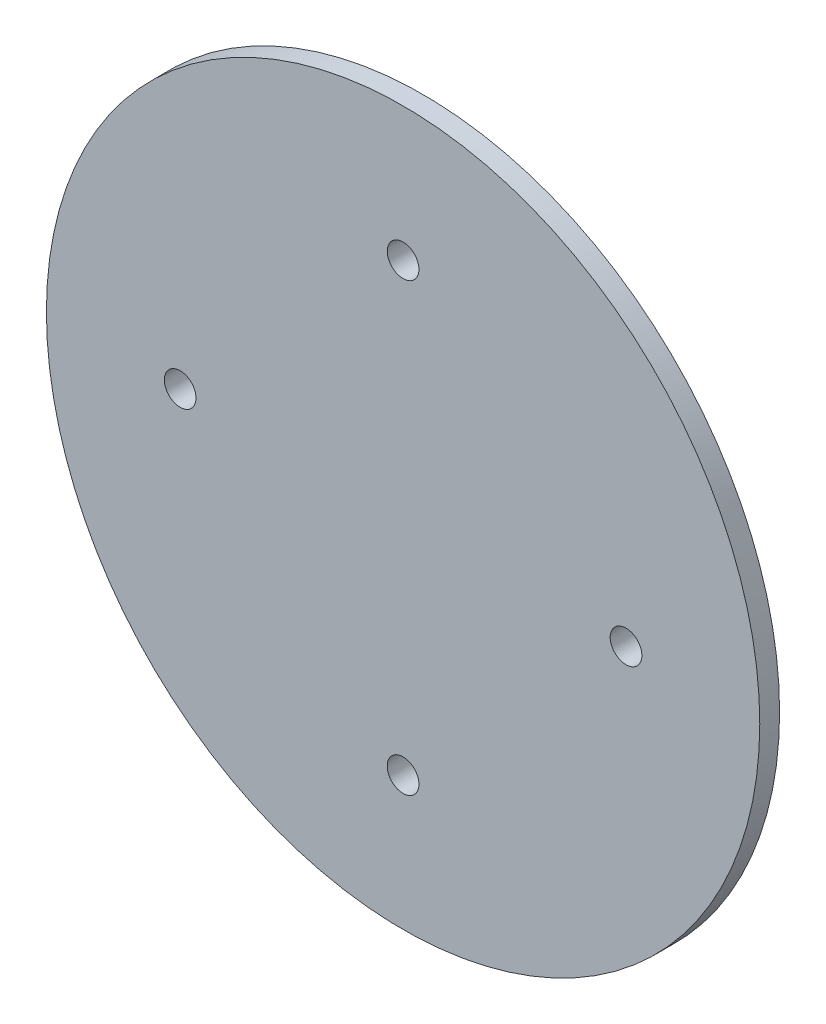
ISO-10303-21;
HEADER;
FILE_DESCRIPTION(('STEP AP214'),'2;1');
FILE_NAME('part.step','',(''),(''),'','','');
FILE_SCHEMA(('AUTOMOTIVE_DESIGN { 1 0 10303 214 1 1 1 1 }'));
ENDSEC;
DATA;
#1=APPLICATION_CONTEXT('core data for automotive mechanical design processes');
#2=APPLICATION_PROTOCOL_DEFINITION('international standard','automotive_design',2000,#1);
#3=PRODUCT_CONTEXT('',#1,'mechanical');
#4=PRODUCT('Part','Part','',(#3));
#5=PRODUCT_RELATED_PRODUCT_CATEGORY('part','',(#4));
#6=PRODUCT_DEFINITION_FORMATION('','',#4);
#7=PRODUCT_DEFINITION_CONTEXT('part definition',#1,'design');
#8=PRODUCT_DEFINITION('design','',#6,#7);
#9=PRODUCT_DEFINITION_SHAPE('','',#8);
#10=(LENGTH_UNIT() NAMED_UNIT(*) SI_UNIT(.MILLI.,.METRE.));
#11=(NAMED_UNIT(*) PLANE_ANGLE_UNIT() SI_UNIT($,.RADIAN.));
#12=(NAMED_UNIT(*) SI_UNIT($,.STERADIAN.) SOLID_ANGLE_UNIT());
#13=UNCERTAINTY_MEASURE_WITH_UNIT(LENGTH_MEASURE(1.E-05),#10,'distance_accuracy_value','');
#14=(GEOMETRIC_REPRESENTATION_CONTEXT(3) GLOBAL_UNCERTAINTY_ASSIGNED_CONTEXT((#13)) GLOBAL_UNIT_ASSIGNED_CONTEXT((#10,
#11,#12)) REPRESENTATION_CONTEXT('',''));
#15=CARTESIAN_POINT('',(0.,0.,0.));
#16=DIRECTION('',(0.,0.,1.));
#17=DIRECTION('',(1.,0.,0.));
#18=AXIS2_PLACEMENT_3D('',#15,#16,#17);
#19=CARTESIAN_POINT('',(0.,0.,4.));
#20=DIRECTION('',(0.,0.,-1.));
#21=DIRECTION('',(-1.,0.,0.));
#22=AXIS2_PLACEMENT_3D('',#19,#20,#21);
#23=CYLINDRICAL_SURFACE('',#22,27.5);
#24=CARTESIAN_POINT('',(0.,0.,4.));
#25=DIRECTION('',(0.,0.,1.));
#26=DIRECTION('',(1.,0.,0.));
#27=AXIS2_PLACEMENT_3D('',#24,#25,#26);
#28=CIRCLE('',#27,27.5);
#29=CARTESIAN_POINT('',(27.5,0.,4.));
#30=VERTEX_POINT('',#29);
#31=EDGE_CURVE('E40',#30,#30,#28,.T.);
#32=ORIENTED_EDGE('',*,*,#31,.F.);
#33=EDGE_LOOP('',(#32));
#34=FACE_BOUND('',#33,.T.);
#35=CARTESIAN_POINT('',(0.,0.,0.));
#36=DIRECTION('',(0.,0.,1.));
#37=DIRECTION('',(1.,0.,0.));
#38=AXIS2_PLACEMENT_3D('',#35,#36,#37);
#39=CIRCLE('',#38,27.5);
#40=CARTESIAN_POINT('',(27.5,0.,0.));
#41=VERTEX_POINT('',#40);
#42=EDGE_CURVE('E36',#41,#41,#39,.T.);
#43=ORIENTED_EDGE('',*,*,#42,.T.);
#44=EDGE_LOOP('',(#43));
#45=FACE_BOUND('',#44,.T.);
#46=ADVANCED_FACE('F33',(#34,#45),#23,.T.);
#47=CARTESIAN_POINT('',(0.,0.,0.));
#48=DIRECTION('',(0.,0.,1.));
#49=DIRECTION('',(1.,0.,0.));
#50=AXIS2_PLACEMENT_3D('',#47,#48,#49);
#51=PLANE('',#50);
#52=CARTESIAN_POINT('',(0.,0.,0.));
#53=DIRECTION('',(0.,0.,-1.));
#54=DIRECTION('',(-1.,0.,0.));
#55=AXIS2_PLACEMENT_3D('',#52,#53,#54);
#56=CIRCLE('',#55,25.4);
#57=CARTESIAN_POINT('',(-25.4,0.,0.));
#58=VERTEX_POINT('',#57);
#59=EDGE_CURVE('E10',#58,#58,#56,.T.);
#60=ORIENTED_EDGE('',*,*,#59,.F.);
#61=EDGE_LOOP('',(#60));
#62=FACE_BOUND('',#61,.T.);
#63=ORIENTED_EDGE('',*,*,#42,.F.);
#64=EDGE_LOOP('',(#63));
#65=FACE_BOUND('',#64,.T.);
#66=ADVANCED_FACE('F101',(#62,#65),#51,.F.);
#67=CARTESIAN_POINT('',(0.,0.,-3.175));
#68=DIRECTION('',(0.,0.,1.));
#69=DIRECTION('',(1.,0.,0.));
#70=AXIS2_PLACEMENT_3D('',#67,#68,#69);
#71=CYLINDRICAL_SURFACE('',#70,25.4);
#72=CARTESIAN_POINT('',(0.,0.,-3.175));
#73=DIRECTION('',(0.,0.,-1.));
#74=DIRECTION('',(-1.,0.,0.));
#75=AXIS2_PLACEMENT_3D('',#72,#73,#74);
#76=CIRCLE('',#75,25.4);
#77=CARTESIAN_POINT('',(-25.4,0.,-3.175));
#78=VERTEX_POINT('',#77);
#79=EDGE_CURVE('E46',#78,#78,#76,.T.);
#80=ORIENTED_EDGE('',*,*,#79,.F.);
#81=EDGE_LOOP('',(#80));
#82=FACE_BOUND('',#81,.T.);
#83=ORIENTED_EDGE('',*,*,#59,.T.);
#84=EDGE_LOOP('',(#83));
#85=FACE_BOUND('',#84,.T.);
#86=ADVANCED_FACE('F106',(#82,#85),#71,.T.);
#87=CARTESIAN_POINT('',(0.,0.,-3.175));
#88=DIRECTION('',(0.,0.,-1.));
#89=DIRECTION('',(-1.,0.,0.));
#90=AXIS2_PLACEMENT_3D('',#87,#88,#89);
#91=PLANE('',#90);
#92=CARTESIAN_POINT('',(0.,22.5,-3.175));
#93=DIRECTION('',(0.,0.,-1.));
#94=DIRECTION('',(-1.,0.,0.));
#95=AXIS2_PLACEMENT_3D('',#92,#93,#94);
#96=CIRCLE('',#95,1.6);
#97=CARTESIAN_POINT('',(-1.6,22.5,-3.175));
#98=VERTEX_POINT('',#97);
#99=EDGE_CURVE('E49',#98,#98,#96,.T.);
#100=ORIENTED_EDGE('',*,*,#99,.F.);
#101=EDGE_LOOP('',(#100));
#102=FACE_BOUND('',#101,.T.);
#103=CARTESIAN_POINT('',(-22.5,0.,-3.175));
#104=DIRECTION('',(0.,0.,-1.));
#105=DIRECTION('',(-1.,0.,0.));
#106=AXIS2_PLACEMENT_3D('',#103,#104,#105);
#107=CIRCLE('',#106,1.6);
#108=CARTESIAN_POINT('',(-24.1,0.,-3.175));
#109=VERTEX_POINT('',#108);
#110=EDGE_CURVE('E57',#109,#109,#107,.T.);
#111=ORIENTED_EDGE('',*,*,#110,.F.);
#112=EDGE_LOOP('',(#111));
#113=FACE_BOUND('',#112,.T.);
#114=CARTESIAN_POINT('',(0.,-22.5,-3.175));
#115=DIRECTION('',(0.,0.,-1.));
#116=DIRECTION('',(-1.,0.,0.));
#117=AXIS2_PLACEMENT_3D('',#114,#115,#116);
#118=CIRCLE('',#117,1.6);
#119=CARTESIAN_POINT('',(-1.6,-22.5,-3.175));
#120=VERTEX_POINT('',#119);
#121=EDGE_CURVE('E53',#120,#120,#118,.T.);
#122=ORIENTED_EDGE('',*,*,#121,.F.);
#123=EDGE_LOOP('',(#122));
#124=FACE_BOUND('',#123,.T.);
#125=CARTESIAN_POINT('',(22.5,0.,-3.175));
#126=DIRECTION('',(0.,0.,-1.));
#127=DIRECTION('',(-1.,0.,0.));
#128=AXIS2_PLACEMENT_3D('',#125,#126,#127);
#129=CIRCLE('',#128,1.6);
#130=CARTESIAN_POINT('',(20.9,0.,-3.175));
#131=VERTEX_POINT('',#130);
#132=EDGE_CURVE('E50',#131,#131,#129,.T.);
#133=ORIENTED_EDGE('',*,*,#132,.F.);
#134=EDGE_LOOP('',(#133));
#135=FACE_BOUND('',#134,.T.);
#136=ORIENTED_EDGE('',*,*,#79,.T.);
#137=EDGE_LOOP('',(#136));
#138=FACE_BOUND('',#137,.T.);
#139=ADVANCED_FACE('F132',(#102,#113,#124,#135,#138),#91,.T.);
#140=CARTESIAN_POINT('',(22.5,0.,4.));
#141=DIRECTION('',(0.,0.,-1.));
#142=DIRECTION('',(-1.,0.,0.));
#143=AXIS2_PLACEMENT_3D('',#140,#141,#142);
#144=CYLINDRICAL_SURFACE('',#143,1.6);
#145=ORIENTED_EDGE('',*,*,#132,.T.);
#146=EDGE_LOOP('',(#145));
#147=FACE_BOUND('',#146,.T.);
#148=CARTESIAN_POINT('',(22.5,0.,6.));
#149=DIRECTION('',(0.,0.,1.));
#150=DIRECTION('',(1.,0.,0.));
#151=AXIS2_PLACEMENT_3D('',#148,#149,#150);
#152=CIRCLE('',#151,1.6);
#153=CARTESIAN_POINT('',(24.1,0.,6.));
#154=VERTEX_POINT('',#153);
#155=EDGE_CURVE('E76',#154,#154,#152,.T.);
#156=ORIENTED_EDGE('',*,*,#155,.T.);
#157=EDGE_LOOP('',(#156));
#158=FACE_BOUND('',#157,.T.);
#159=ADVANCED_FACE('F80',(#147,#158),#144,.F.);
#160=CARTESIAN_POINT('',(0.,-22.5,4.));
#161=DIRECTION('',(0.,0.,-1.));
#162=DIRECTION('',(-1.,0.,0.));
#163=AXIS2_PLACEMENT_3D('',#160,#161,#162);
#164=CYLINDRICAL_SURFACE('',#163,1.6);
#165=ORIENTED_EDGE('',*,*,#121,.T.);
#166=EDGE_LOOP('',(#165));
#167=FACE_BOUND('',#166,.T.);
#168=CARTESIAN_POINT('',(0.,-22.5,6.));
#169=DIRECTION('',(0.,0.,1.));
#170=DIRECTION('',(1.,0.,0.));
#171=AXIS2_PLACEMENT_3D('',#168,#169,#170);
#172=CIRCLE('',#171,1.6);
#173=CARTESIAN_POINT('',(1.6,-22.5,6.));
#174=VERTEX_POINT('',#173);
#175=EDGE_CURVE('E73',#174,#174,#172,.T.);
#176=ORIENTED_EDGE('',*,*,#175,.T.);
#177=EDGE_LOOP('',(#176));
#178=FACE_BOUND('',#177,.T.);
#179=ADVANCED_FACE('F125',(#167,#178),#164,.F.);
#180=CARTESIAN_POINT('',(-22.5,0.,4.));
#181=DIRECTION('',(0.,0.,-1.));
#182=DIRECTION('',(-1.,0.,0.));
#183=AXIS2_PLACEMENT_3D('',#180,#181,#182);
#184=CYLINDRICAL_SURFACE('',#183,1.6);
#185=ORIENTED_EDGE('',*,*,#110,.T.);
#186=EDGE_LOOP('',(#185));
#187=FACE_BOUND('',#186,.T.);
#188=CARTESIAN_POINT('',(-22.5,0.,6.));
#189=DIRECTION('',(0.,0.,1.));
#190=DIRECTION('',(1.,0.,0.));
#191=AXIS2_PLACEMENT_3D('',#188,#189,#190);
#192=CIRCLE('',#191,1.6);
#193=CARTESIAN_POINT('',(-20.9,0.,6.));
#194=VERTEX_POINT('',#193);
#195=EDGE_CURVE('E70',#194,#194,#192,.T.);
#196=ORIENTED_EDGE('',*,*,#195,.T.);
#197=EDGE_LOOP('',(#196));
#198=FACE_BOUND('',#197,.T.);
#199=ADVANCED_FACE('F95',(#187,#198),#184,.F.);
#200=CARTESIAN_POINT('',(0.,22.5,4.));
#201=DIRECTION('',(0.,0.,-1.));
#202=DIRECTION('',(-1.,0.,0.));
#203=AXIS2_PLACEMENT_3D('',#200,#201,#202);
#204=CYLINDRICAL_SURFACE('',#203,1.6);
#205=ORIENTED_EDGE('',*,*,#99,.T.);
#206=EDGE_LOOP('',(#205));
#207=FACE_BOUND('',#206,.T.);
#208=CARTESIAN_POINT('',(0.,22.5,6.));
#209=DIRECTION('',(0.,0.,1.));
#210=DIRECTION('',(1.,0.,0.));
#211=AXIS2_PLACEMENT_3D('',#208,#209,#210);
#212=CIRCLE('',#211,1.6);
#213=CARTESIAN_POINT('',(1.6,22.5,6.));
#214=VERTEX_POINT('',#213);
#215=EDGE_CURVE('E65',#214,#214,#212,.T.);
#216=ORIENTED_EDGE('',*,*,#215,.T.);
#217=EDGE_LOOP('',(#216));
#218=FACE_BOUND('',#217,.T.);
#219=ADVANCED_FACE('F85',(#207,#218),#204,.F.);
#220=CARTESIAN_POINT('',(0.,0.,6.));
#221=DIRECTION('',(0.,0.,1.));
#222=DIRECTION('',(1.,0.,0.));
#223=AXIS2_PLACEMENT_3D('',#220,#221,#222);
#224=PLANE('',#223);
#225=ORIENTED_EDGE('',*,*,#175,.F.);
#226=EDGE_LOOP('',(#225));
#227=FACE_BOUND('',#226,.T.);
#228=ORIENTED_EDGE('',*,*,#215,.F.);
#229=EDGE_LOOP('',(#228));
#230=FACE_BOUND('',#229,.T.);
#231=CARTESIAN_POINT('',(0.,0.,6.));
#232=DIRECTION('',(0.,0.,1.));
#233=DIRECTION('',(1.,0.,0.));
#234=AXIS2_PLACEMENT_3D('',#231,#232,#233);
#235=CIRCLE('',#234,36.);
#236=CARTESIAN_POINT('',(36.,0.,6.));
#237=VERTEX_POINT('',#236);
#238=EDGE_CURVE('E54',#237,#237,#235,.T.);
#239=ORIENTED_EDGE('',*,*,#238,.T.);
#240=EDGE_LOOP('',(#239));
#241=FACE_BOUND('',#240,.T.);
#242=ORIENTED_EDGE('',*,*,#195,.F.);
#243=EDGE_LOOP('',(#242));
#244=FACE_BOUND('',#243,.T.);
#245=ORIENTED_EDGE('',*,*,#155,.F.);
#246=EDGE_LOOP('',(#245));
#247=FACE_BOUND('',#246,.T.);
#248=ADVANCED_FACE('F82',(#227,#230,#241,#244,#247),#224,.T.);
#249=CARTESIAN_POINT('',(0.,0.,4.));
#250=DIRECTION('',(0.,0.,1.));
#251=DIRECTION('',(1.,0.,0.));
#252=AXIS2_PLACEMENT_3D('',#249,#250,#251);
#253=PLANE('',#252);
#254=ORIENTED_EDGE('',*,*,#31,.T.);
#255=EDGE_LOOP('',(#254));
#256=FACE_BOUND('',#255,.T.);
#257=CARTESIAN_POINT('',(0.,0.,4.));
#258=DIRECTION('',(0.,0.,1.));
#259=DIRECTION('',(1.,0.,0.));
#260=AXIS2_PLACEMENT_3D('',#257,#258,#259);
#261=CIRCLE('',#260,36.);
#262=CARTESIAN_POINT('',(36.,0.,4.));
#263=VERTEX_POINT('',#262);
#264=EDGE_CURVE('E62',#263,#263,#261,.T.);
#265=ORIENTED_EDGE('',*,*,#264,.F.);
#266=EDGE_LOOP('',(#265));
#267=FACE_BOUND('',#266,.T.);
#268=ADVANCED_FACE('F84',(#256,#267),#253,.F.);
#269=CARTESIAN_POINT('',(0.,0.,6.));
#270=DIRECTION('',(0.,0.,-1.));
#271=DIRECTION('',(-1.,0.,0.));
#272=AXIS2_PLACEMENT_3D('',#269,#270,#271);
#273=CYLINDRICAL_SURFACE('',#272,36.);
#274=ORIENTED_EDGE('',*,*,#238,.F.);
#275=EDGE_LOOP('',(#274));
#276=FACE_BOUND('',#275,.T.);
#277=ORIENTED_EDGE('',*,*,#264,.T.);
#278=EDGE_LOOP('',(#277));
#279=FACE_BOUND('',#278,.T.);
#280=ADVANCED_FACE('F92',(#276,#279),#273,.T.);
#281=CLOSED_SHELL('',(#46,#66,#86,#139,#159,#179,#199,#219,#248,#268,#280));
#282=MANIFOLD_SOLID_BREP('B2',#281);
#283=ADVANCED_BREP_SHAPE_REPRESENTATION('',(#18,#282),#14);
#284=SHAPE_DEFINITION_REPRESENTATION(#9,#283);
ENDSEC;
END-ISO-10303-21;
